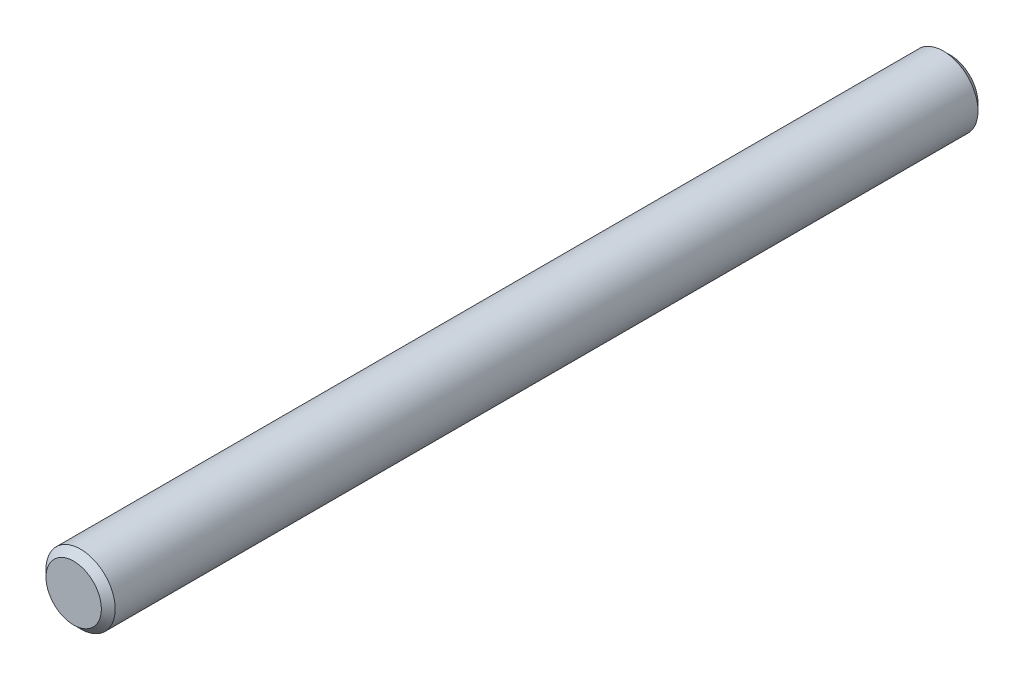
ISO-10303-21;
HEADER;
FILE_DESCRIPTION(('STEP AP214'),'2;1');
FILE_NAME('part.step','',(''),(''),'','','');
FILE_SCHEMA(('AUTOMOTIVE_DESIGN { 1 0 10303 214 1 1 1 1 }'));
ENDSEC;
DATA;
#1=APPLICATION_CONTEXT('core data for automotive mechanical design processes');
#2=APPLICATION_PROTOCOL_DEFINITION('international standard','automotive_design',2000,#1);
#3=PRODUCT_CONTEXT('',#1,'mechanical');
#4=PRODUCT('Part','Part','',(#3));
#5=PRODUCT_RELATED_PRODUCT_CATEGORY('part','',(#4));
#6=PRODUCT_DEFINITION_FORMATION('','',#4);
#7=PRODUCT_DEFINITION_CONTEXT('part definition',#1,'design');
#8=PRODUCT_DEFINITION('design','',#6,#7);
#9=PRODUCT_DEFINITION_SHAPE('','',#8);
#10=(LENGTH_UNIT() NAMED_UNIT(*) SI_UNIT(.MILLI.,.METRE.));
#11=(NAMED_UNIT(*) PLANE_ANGLE_UNIT() SI_UNIT($,.RADIAN.));
#12=(NAMED_UNIT(*) SI_UNIT($,.STERADIAN.) SOLID_ANGLE_UNIT());
#13=UNCERTAINTY_MEASURE_WITH_UNIT(LENGTH_MEASURE(1.E-05),#10,'distance_accuracy_value','');
#14=(GEOMETRIC_REPRESENTATION_CONTEXT(3) GLOBAL_UNCERTAINTY_ASSIGNED_CONTEXT((#13)) GLOBAL_UNIT_ASSIGNED_CONTEXT((#10,
#11,#12)) REPRESENTATION_CONTEXT('',''));
#15=CARTESIAN_POINT('',(0.,0.,0.));
#16=DIRECTION('',(0.,0.,1.));
#17=DIRECTION('',(1.,0.,0.));
#18=AXIS2_PLACEMENT_3D('',#15,#16,#17);
#19=CARTESIAN_POINT('',(0.,0.,60.325));
#20=DIRECTION('',(0.,0.,-1.));
#21=DIRECTION('',(-1.,0.,0.));
#22=AXIS2_PLACEMENT_3D('',#19,#20,#21);
#23=CYLINDRICAL_SURFACE('',#22,4.7625);
#24=CARTESIAN_POINT('',(0.,0.,-59.3724999999999));
#25=DIRECTION('',(0.,0.,1.));
#26=DIRECTION('',(1.,0.,0.));
#27=AXIS2_PLACEMENT_3D('',#24,#25,#26);
#28=CIRCLE('',#27,4.7625);
#29=CARTESIAN_POINT('',(-4.7625,0.,-59.3724999999999));
#30=VERTEX_POINT('',#29);
#31=EDGE_CURVE('E50',#30,#30,#28,.T.);
#32=CARTESIAN_POINT('',(0.,0.,59.3725));
#33=DIRECTION('',(0.,0.,1.));
#34=DIRECTION('',(1.,0.,0.));
#35=AXIS2_PLACEMENT_3D('',#32,#33,#34);
#36=CIRCLE('',#35,4.7625);
#37=CARTESIAN_POINT('',(-4.7625,0.,59.3725));
#38=VERTEX_POINT('',#37);
#39=EDGE_CURVE('E55',#38,#38,#36,.F.);
#40=CARTESIAN_POINT('',(-4.7625,0.,-59.3724999999999));
#41=CARTESIAN_POINT('',(-4.7625,0.,-58.1355729166666));
#42=CARTESIAN_POINT('',(-4.7625,0.,-56.8986458333332));
#43=CARTESIAN_POINT('',(-4.7625,0.,-54.4247916666666));
#44=CARTESIAN_POINT('',(-4.7625,0.,-53.1878645833333));
#45=CARTESIAN_POINT('',(-4.7625,0.,-50.7140104166666));
#46=CARTESIAN_POINT('',(-4.7625,0.,-49.4770833333333));
#47=CARTESIAN_POINT('',(-4.7625,0.,-47.0032291666666));
#48=CARTESIAN_POINT('',(-4.7625,0.,-45.7663020833333));
#49=CARTESIAN_POINT('',(-4.7625,0.,-43.2924479166666));
#50=CARTESIAN_POINT('',(-4.7625,0.,-42.0555208333332));
#51=CARTESIAN_POINT('',(-4.7625,0.,-39.5816666666666));
#52=CARTESIAN_POINT('',(-4.7625,0.,-38.3447395833333));
#53=CARTESIAN_POINT('',(-4.7625,0.,-35.8708854166666));
#54=CARTESIAN_POINT('',(-4.7625,0.,-34.6339583333333));
#55=CARTESIAN_POINT('',(-4.7625,0.,-32.1601041666666));
#56=CARTESIAN_POINT('',(-4.7625,0.,-30.9231770833333));
#57=CARTESIAN_POINT('',(-4.7625,0.,-28.4493229166666));
#58=CARTESIAN_POINT('',(-4.7625,0.,-27.2123958333333));
#59=CARTESIAN_POINT('',(-4.7625,0.,-24.7385416666666));
#60=CARTESIAN_POINT('',(-4.7625,0.,-23.5016145833333));
#61=CARTESIAN_POINT('',(-4.7625,0.,-21.0277604166666));
#62=CARTESIAN_POINT('',(-4.7625,0.,-19.7908333333333));
#63=CARTESIAN_POINT('',(-4.7625,0.,-17.3169791666666));
#64=CARTESIAN_POINT('',(-4.7625,0.,-16.0800520833333));
#65=CARTESIAN_POINT('',(-4.7625,0.,-13.6061979166666));
#66=CARTESIAN_POINT('',(-4.7625,0.,-12.3692708333333));
#67=CARTESIAN_POINT('',(-4.7625,0.,-9.89541666666659));
#68=CARTESIAN_POINT('',(-4.7625,0.,-8.65848958333326));
#69=CARTESIAN_POINT('',(-4.7625,0.,-6.1846354166666));
#70=CARTESIAN_POINT('',(-4.7625,0.,-4.94770833333326));
#71=CARTESIAN_POINT('',(-4.7625,0.,-2.4738541666666));
#72=CARTESIAN_POINT('',(-4.7625,0.,-1.23692708333327));
#73=CARTESIAN_POINT('',(-4.7625,0.,1.23692708333339));
#74=CARTESIAN_POINT('',(-4.7625,0.,2.47385416666673));
#75=CARTESIAN_POINT('',(-4.7625,0.,4.94770833333339));
#76=CARTESIAN_POINT('',(-4.7625,0.,6.18463541666673));
#77=CARTESIAN_POINT('',(-4.7625,0.,8.6584895833334));
#78=CARTESIAN_POINT('',(-4.7625,0.,9.89541666666673));
#79=CARTESIAN_POINT('',(-4.7625,0.,12.3692708333334));
#80=CARTESIAN_POINT('',(-4.7625,0.,13.6061979166667));
#81=CARTESIAN_POINT('',(-4.7625,0.,16.0800520833334));
#82=CARTESIAN_POINT('',(-4.7625,0.,17.3169791666667));
#83=CARTESIAN_POINT('',(-4.7625,0.,19.7908333333334));
#84=CARTESIAN_POINT('',(-4.7625,0.,21.0277604166667));
#85=CARTESIAN_POINT('',(-4.7625,0.,23.5016145833334));
#86=CARTESIAN_POINT('',(-4.7625,0.,24.7385416666667));
#87=CARTESIAN_POINT('',(-4.7625,0.,27.2123958333334));
#88=CARTESIAN_POINT('',(-4.7625,0.,28.4493229166667));
#89=CARTESIAN_POINT('',(-4.7625,0.,30.9231770833334));
#90=CARTESIAN_POINT('',(-4.7625,0.,32.1601041666667));
#91=CARTESIAN_POINT('',(-4.7625,0.,34.6339583333334));
#92=CARTESIAN_POINT('',(-4.7625,0.,35.8708854166667));
#93=CARTESIAN_POINT('',(-4.7625,0.,38.3447395833334));
#94=CARTESIAN_POINT('',(-4.7625,0.,39.5816666666667));
#95=CARTESIAN_POINT('',(-4.7625,0.,42.0555208333334));
#96=CARTESIAN_POINT('',(-4.7625,0.,43.2924479166667));
#97=CARTESIAN_POINT('',(-4.7625,0.,45.7663020833334));
#98=CARTESIAN_POINT('',(-4.7625,0.,47.0032291666667));
#99=CARTESIAN_POINT('',(-4.7625,0.,49.4770833333334));
#100=CARTESIAN_POINT('',(-4.7625,0.,50.7140104166667));
#101=CARTESIAN_POINT('',(-4.7625,0.,53.1878645833334));
#102=CARTESIAN_POINT('',(-4.7625,0.,54.4247916666667));
#103=CARTESIAN_POINT('',(-4.7625,0.,56.8986458333334));
#104=CARTESIAN_POINT('',(-4.7625,0.,58.1355729166667));
#105=CARTESIAN_POINT('',(-4.7625,0.,59.3725));
#106=B_SPLINE_CURVE_WITH_KNOTS('',3,(#40,#41,#42,#43,#44,#45,#46,#47,#48,#49,#50,#51,#52,#53,
#54,#55,#56,#57,#58,#59,#60,#61,#62,#63,#64,#65,#66,#67,#68,#69,#70,#71,#72,#73,#74,#75,#76,#77,
#78,#79,#80,#81,#82,#83,#84,#85,#86,#87,#88,#89,#90,#91,#92,#93,#94,#95,#96,#97,#98,#99,#100,
#101,#102,#103,#104,#105),.UNSPECIFIED.,.F.,.F.,(4,2,2,2,2,2,2,2,2,2,2,2,2,2,2,2,2,2,2,2,2,2,2,
2,2,2,2,2,2,2,2,2,4),(0.,3.71078125,7.42156249999999,11.13234375,14.843125,18.55390625,
22.2646875,25.97546875,29.68625,33.39703125,37.1078125,40.81859375,44.529375,48.24015625,
51.9509375,55.66171875,59.3725,63.08328125,66.7940625,70.50484375,74.215625,77.92640625,
81.6371875,85.34796875,89.05875,92.76953125,96.4803125,100.19109375,103.901875,107.61265625,
111.3234375,115.03421875,118.745),.UNSPECIFIED.);
#107=EDGE_CURVE('BSEAM37',#30,#38,#106,.T.);
#108=ORIENTED_EDGE('',*,*,#31,.T.);
#109=ORIENTED_EDGE('',*,*,#39,.T.);
#110=ORIENTED_EDGE('',*,*,#107,.T.);
#111=ORIENTED_EDGE('',*,*,#107,.F.);
#112=EDGE_LOOP('',(#108,#110,#109,#111));
#113=FACE_BOUND('',#112,.T.);
#114=ADVANCED_FACE('F37',(#113),#23,.T.);
#115=CARTESIAN_POINT('',(0.,0.,60.325));
#116=DIRECTION('',(0.,0.,1.));
#117=DIRECTION('',(1.,0.,0.));
#118=AXIS2_PLACEMENT_3D('',#115,#116,#117);
#119=PLANE('',#118);
#120=CARTESIAN_POINT('',(0.,0.,60.325));
#121=DIRECTION('',(0.,0.,1.));
#122=DIRECTION('',(1.,0.,0.));
#123=AXIS2_PLACEMENT_3D('',#120,#121,#122);
#124=CIRCLE('',#123,3.81000000000005);
#125=CARTESIAN_POINT('',(3.81000000000005,0.,60.325));
#126=VERTEX_POINT('',#125);
#127=EDGE_CURVE('E10',#126,#126,#124,.T.);
#128=ORIENTED_EDGE('',*,*,#127,.T.);
#129=EDGE_LOOP('',(#128));
#130=FACE_BOUND('',#129,.T.);
#131=ADVANCED_FACE('F72',(#130),#119,.T.);
#132=CARTESIAN_POINT('',(0.,0.,-60.325));
#133=DIRECTION('',(0.,0.,1.));
#134=DIRECTION('',(1.,0.,0.));
#135=AXIS2_PLACEMENT_3D('',#132,#133,#134);
#136=PLANE('',#135);
#137=CARTESIAN_POINT('',(0.,0.,-60.325));
#138=DIRECTION('',(0.,0.,1.));
#139=DIRECTION('',(1.,0.,0.));
#140=AXIS2_PLACEMENT_3D('',#137,#138,#139);
#141=CIRCLE('',#140,3.80999999999992);
#142=CARTESIAN_POINT('',(3.80999999999992,0.,-60.325));
#143=VERTEX_POINT('',#142);
#144=EDGE_CURVE('E45',#143,#143,#141,.F.);
#145=ORIENTED_EDGE('',*,*,#144,.T.);
#146=EDGE_LOOP('',(#145));
#147=FACE_BOUND('',#146,.T.);
#148=ADVANCED_FACE('F69',(#147),#136,.F.);
#149=CARTESIAN_POINT('',(0.,0.,-59.3724999999999));
#150=DIRECTION('',(0.,0.,1.));
#151=DIRECTION('',(1.,0.,0.));
#152=AXIS2_PLACEMENT_3D('',#149,#150,#151);
#153=CONICAL_SURFACE('',#152,4.7625,0.78539816339744);
#154=ORIENTED_EDGE('',*,*,#144,.F.);
#155=EDGE_LOOP('',(#154));
#156=FACE_BOUND('',#155,.T.);
#157=ORIENTED_EDGE('',*,*,#31,.F.);
#158=EDGE_LOOP('',(#157));
#159=FACE_BOUND('',#158,.T.);
#160=ADVANCED_FACE('F65',(#156,#159),#153,.T.);
#161=CARTESIAN_POINT('',(0.,0.,60.325));
#162=DIRECTION('',(0.,0.,-1.));
#163=DIRECTION('',(-1.,0.,0.));
#164=AXIS2_PLACEMENT_3D('',#161,#162,#163);
#165=CONICAL_SURFACE('',#164,3.81000000000005,0.785398163397447);
#166=ORIENTED_EDGE('',*,*,#39,.F.);
#167=EDGE_LOOP('',(#166));
#168=FACE_BOUND('',#167,.T.);
#169=ORIENTED_EDGE('',*,*,#127,.F.);
#170=EDGE_LOOP('',(#169));
#171=FACE_BOUND('',#170,.T.);
#172=ADVANCED_FACE('F39',(#168,#171),#165,.T.);
#173=CLOSED_SHELL('',(#114,#131,#148,#160,#172));
#174=MANIFOLD_SOLID_BREP('B2',#173);
#175=ADVANCED_BREP_SHAPE_REPRESENTATION('',(#18,#174),#14);
#176=SHAPE_DEFINITION_REPRESENTATION(#9,#175);
ENDSEC;
END-ISO-10303-21;
